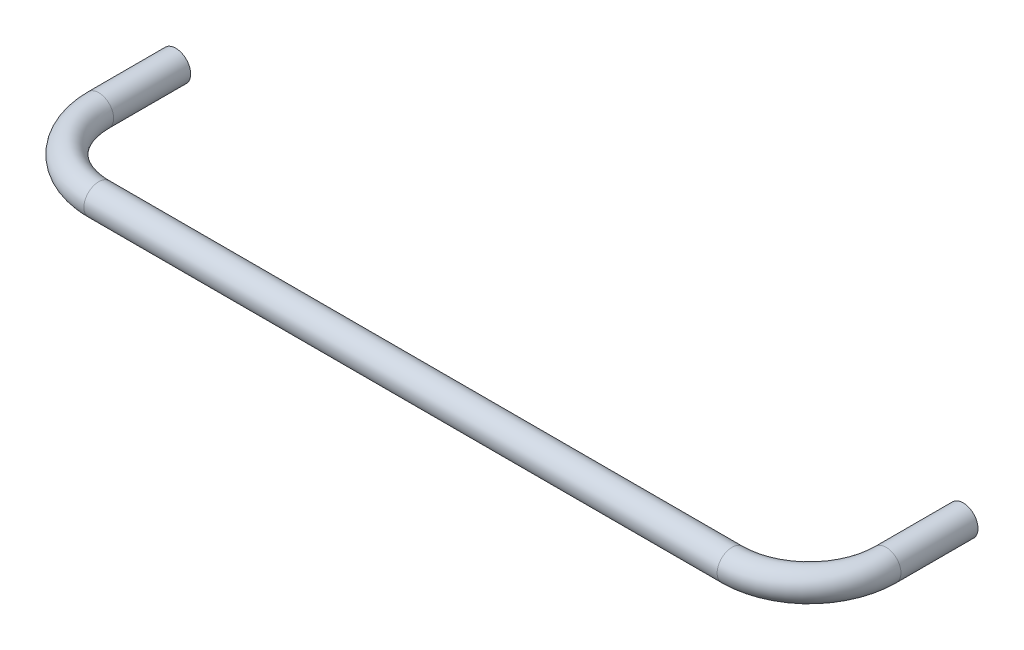
ISO-10303-21;
HEADER;
FILE_DESCRIPTION(('STEP AP214'),'2;1');
FILE_NAME('part.step','',(''),(''),'','','');
FILE_SCHEMA(('AUTOMOTIVE_DESIGN { 1 0 10303 214 1 1 1 1 }'));
ENDSEC;
DATA;
#1=APPLICATION_CONTEXT('core data for automotive mechanical design processes');
#2=APPLICATION_PROTOCOL_DEFINITION('international standard','automotive_design',2000,#1);
#3=PRODUCT_CONTEXT('',#1,'mechanical');
#4=PRODUCT('Part','Part','',(#3));
#5=PRODUCT_RELATED_PRODUCT_CATEGORY('part','',(#4));
#6=PRODUCT_DEFINITION_FORMATION('','',#4);
#7=PRODUCT_DEFINITION_CONTEXT('part definition',#1,'design');
#8=PRODUCT_DEFINITION('design','',#6,#7);
#9=PRODUCT_DEFINITION_SHAPE('','',#8);
#10=(LENGTH_UNIT() NAMED_UNIT(*) SI_UNIT(.MILLI.,.METRE.));
#11=(NAMED_UNIT(*) PLANE_ANGLE_UNIT() SI_UNIT($,.RADIAN.));
#12=(NAMED_UNIT(*) SI_UNIT($,.STERADIAN.) SOLID_ANGLE_UNIT());
#13=UNCERTAINTY_MEASURE_WITH_UNIT(LENGTH_MEASURE(1.E-05),#10,'distance_accuracy_value','');
#14=(GEOMETRIC_REPRESENTATION_CONTEXT(3) GLOBAL_UNCERTAINTY_ASSIGNED_CONTEXT((#13)) GLOBAL_UNIT_ASSIGNED_CONTEXT((#10,
#11,#12)) REPRESENTATION_CONTEXT('',''));
#15=CARTESIAN_POINT('',(0.,0.,0.));
#16=DIRECTION('',(0.,0.,1.));
#17=DIRECTION('',(1.,0.,0.));
#18=AXIS2_PLACEMENT_3D('',#15,#16,#17);
#19=CARTESIAN_POINT('',(-929.75,-204.124413299938,270.846771928839));
#20=DIRECTION('',(0.,0.,-1.));
#21=DIRECTION('',(-1.,0.,0.));
#22=AXIS2_PLACEMENT_3D('',#19,#20,#21);
#23=PLANE('',#22);
#24=CARTESIAN_POINT('',(-929.75,-204.124413299938,270.846771928839));
#25=DIRECTION('',(0.,0.,1.));
#26=DIRECTION('',(1.,0.,0.));
#27=AXIS2_PLACEMENT_3D('',#24,#25,#26);
#28=CIRCLE('',#27,10.9999999999999);
#29=CARTESIAN_POINT('',(-918.75,-204.124413299938,270.846771928839));
#30=VERTEX_POINT('',#29);
#31=EDGE_CURVE('E17',#30,#30,#28,.T.);
#32=ORIENTED_EDGE('',*,*,#31,.F.);
#33=EDGE_LOOP('',(#32));
#34=FACE_BOUND('',#33,.T.);
#35=ADVANCED_FACE('F14',(#34),#23,.T.);
#36=CARTESIAN_POINT('',(-347.25,-204.124413299938,270.846771928839));
#37=DIRECTION('',(0.,0.,-1.));
#38=DIRECTION('',(-1.,0.,0.));
#39=AXIS2_PLACEMENT_3D('',#36,#37,#38);
#40=PLANE('',#39);
#41=CARTESIAN_POINT('',(-347.25,-204.124413299938,270.846771928839));
#42=DIRECTION('',(0.,0.,1.));
#43=DIRECTION('',(1.,0.,0.));
#44=AXIS2_PLACEMENT_3D('',#41,#42,#43);
#45=CIRCLE('',#44,11.);
#46=CARTESIAN_POINT('',(-336.25,-204.124413299938,270.846771928839));
#47=VERTEX_POINT('',#46);
#48=EDGE_CURVE('E49',#47,#47,#45,.T.);
#49=ORIENTED_EDGE('',*,*,#48,.F.);
#50=EDGE_LOOP('',(#49));
#51=FACE_BOUND('',#50,.T.);
#52=ADVANCED_FACE('F59',(#51),#40,.T.);
#53=CARTESIAN_POINT('',(-929.75,-204.124413299938,270.846771928839));
#54=DIRECTION('',(0.,0.,1.));
#55=DIRECTION('',(1.,0.,0.));
#56=AXIS2_PLACEMENT_3D('',#53,#54,#55);
#57=CYLINDRICAL_SURFACE('',#56,10.9999999999999);
#58=CARTESIAN_POINT('',(-929.75,-204.124413299938,327.846771928839));
#59=DIRECTION('',(0.,0.,1.));
#60=DIRECTION('',(-1.,0.,0.));
#61=AXIS2_PLACEMENT_3D('',#58,#59,#60);
#62=CIRCLE('',#61,10.9999999999999);
#63=CARTESIAN_POINT('',(-940.75,-204.124413299938,327.846771928839));
#64=VERTEX_POINT('',#63);
#65=EDGE_CURVE('E47',#64,#64,#62,.T.);
#66=ORIENTED_EDGE('',*,*,#65,.F.);
#67=EDGE_LOOP('',(#66));
#68=FACE_BOUND('',#67,.T.);
#69=ORIENTED_EDGE('',*,*,#31,.T.);
#70=EDGE_LOOP('',(#69));
#71=FACE_BOUND('',#70,.T.);
#72=ADVANCED_FACE('F56',(#68,#71),#57,.T.);
#73=CARTESIAN_POINT('',(-347.25,-204.124413299938,270.846771928839));
#74=DIRECTION('',(0.,0.,1.));
#75=DIRECTION('',(1.,0.,0.));
#76=AXIS2_PLACEMENT_3D('',#73,#74,#75);
#77=CYLINDRICAL_SURFACE('',#76,11.);
#78=CARTESIAN_POINT('',(-347.25,-204.124413299938,327.846771928839));
#79=DIRECTION('',(0.,0.,-1.));
#80=DIRECTION('',(1.,0.,0.));
#81=AXIS2_PLACEMENT_3D('',#78,#79,#80);
#82=CIRCLE('',#81,11.);
#83=CARTESIAN_POINT('',(-336.25,-204.124413299938,327.846771928839));
#84=VERTEX_POINT('',#83);
#85=EDGE_CURVE('E26',#84,#84,#82,.F.);
#86=ORIENTED_EDGE('',*,*,#85,.F.);
#87=EDGE_LOOP('',(#86));
#88=FACE_BOUND('',#87,.T.);
#89=ORIENTED_EDGE('',*,*,#48,.T.);
#90=EDGE_LOOP('',(#89));
#91=FACE_BOUND('',#90,.T.);
#92=ADVANCED_FACE('F42',(#88,#91),#77,.T.);
#93=CARTESIAN_POINT('',(-872.75,-204.124413299938,327.846771928839));
#94=DIRECTION('',(0.,1.,0.));
#95=DIRECTION('',(0.,0.,1.));
#96=AXIS2_PLACEMENT_3D('',#93,#94,#95);
#97=TOROIDAL_SURFACE('',#96,57.,10.9999999999999);
#98=CARTESIAN_POINT('',(-872.75,-204.124413299938,384.846771928839));
#99=DIRECTION('',(1.,0.,0.));
#100=DIRECTION('',(0.,0.,-1.));
#101=AXIS2_PLACEMENT_3D('',#98,#99,#100);
#102=CIRCLE('',#101,11.);
#103=CARTESIAN_POINT('',(-872.75,-204.124413299938,373.846771928839));
#104=VERTEX_POINT('',#103);
#105=EDGE_CURVE('E21',#104,#104,#102,.T.);
#106=ORIENTED_EDGE('',*,*,#105,.F.);
#107=EDGE_LOOP('',(#106));
#108=FACE_BOUND('',#107,.T.);
#109=ORIENTED_EDGE('',*,*,#65,.T.);
#110=EDGE_LOOP('',(#109));
#111=FACE_BOUND('',#110,.T.);
#112=ADVANCED_FACE('F38',(#108,#111),#97,.T.);
#113=CARTESIAN_POINT('',(-404.25,-204.124413299938,327.846771928839));
#114=DIRECTION('',(0.,1.,0.));
#115=DIRECTION('',(0.,0.,1.));
#116=AXIS2_PLACEMENT_3D('',#113,#114,#115);
#117=TOROIDAL_SURFACE('',#116,57.,11.);
#118=ORIENTED_EDGE('',*,*,#85,.T.);
#119=EDGE_LOOP('',(#118));
#120=FACE_BOUND('',#119,.T.);
#121=CARTESIAN_POINT('',(-404.25,-204.124413299938,384.846771928839));
#122=DIRECTION('',(1.,0.,0.));
#123=DIRECTION('',(0.,0.,-1.));
#124=AXIS2_PLACEMENT_3D('',#121,#122,#123);
#125=CIRCLE('',#124,11.);
#126=CARTESIAN_POINT('',(-404.25,-204.124413299938,373.846771928839));
#127=VERTEX_POINT('',#126);
#128=EDGE_CURVE('E10',#127,#127,#125,.F.);
#129=ORIENTED_EDGE('',*,*,#128,.F.);
#130=EDGE_LOOP('',(#129));
#131=FACE_BOUND('',#130,.T.);
#132=ADVANCED_FACE('F33',(#120,#131),#117,.T.);
#133=CARTESIAN_POINT('',(-872.75,-204.124413299938,384.846771928839));
#134=DIRECTION('',(1.,0.,0.));
#135=DIRECTION('',(0.,0.,-1.));
#136=AXIS2_PLACEMENT_3D('',#133,#134,#135);
#137=CYLINDRICAL_SURFACE('',#136,11.);
#138=ORIENTED_EDGE('',*,*,#128,.T.);
#139=EDGE_LOOP('',(#138));
#140=FACE_BOUND('',#139,.T.);
#141=ORIENTED_EDGE('',*,*,#105,.T.);
#142=EDGE_LOOP('',(#141));
#143=FACE_BOUND('',#142,.T.);
#144=ADVANCED_FACE('F37',(#140,#143),#137,.T.);
#145=CLOSED_SHELL('',(#35,#52,#72,#92,#112,#132,#144));
#146=MANIFOLD_SOLID_BREP('B1',#145);
#147=ADVANCED_BREP_SHAPE_REPRESENTATION('',(#18,#146),#14);
#148=SHAPE_DEFINITION_REPRESENTATION(#9,#147);
ENDSEC;
END-ISO-10303-21;
